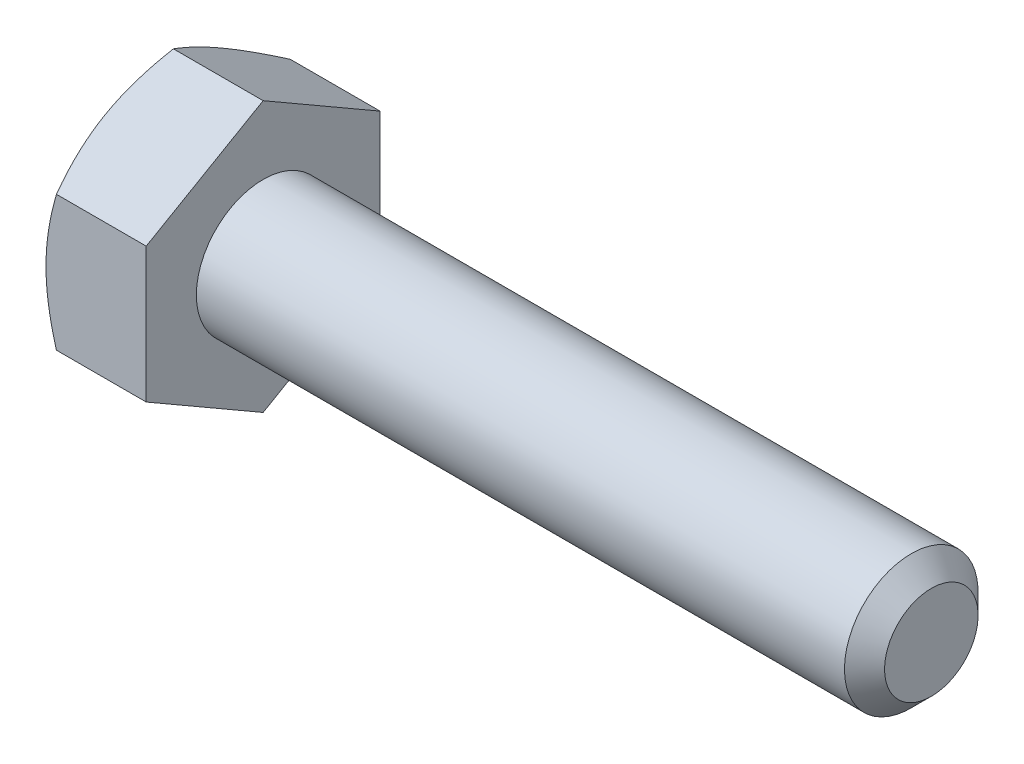
ISO-10303-21;
HEADER;
FILE_DESCRIPTION(('STEP AP214'),'2;1');
FILE_NAME('part.step','',(''),(''),'','','');
FILE_SCHEMA(('AUTOMOTIVE_DESIGN { 1 0 10303 214 1 1 1 1 }'));
ENDSEC;
DATA;
#1=APPLICATION_CONTEXT('core data for automotive mechanical design processes');
#2=APPLICATION_PROTOCOL_DEFINITION('international standard','automotive_design',2000,#1);
#3=PRODUCT_CONTEXT('',#1,'mechanical');
#4=PRODUCT('Part','Part','',(#3));
#5=PRODUCT_RELATED_PRODUCT_CATEGORY('part','',(#4));
#6=PRODUCT_DEFINITION_FORMATION('','',#4);
#7=PRODUCT_DEFINITION_CONTEXT('part definition',#1,'design');
#8=PRODUCT_DEFINITION('design','',#6,#7);
#9=PRODUCT_DEFINITION_SHAPE('','',#8);
#10=(LENGTH_UNIT() NAMED_UNIT(*) SI_UNIT(.MILLI.,.METRE.));
#11=(NAMED_UNIT(*) PLANE_ANGLE_UNIT() SI_UNIT($,.RADIAN.));
#12=(NAMED_UNIT(*) SI_UNIT($,.STERADIAN.) SOLID_ANGLE_UNIT());
#13=UNCERTAINTY_MEASURE_WITH_UNIT(LENGTH_MEASURE(1.E-05),#10,'distance_accuracy_value','');
#14=(GEOMETRIC_REPRESENTATION_CONTEXT(3) GLOBAL_UNCERTAINTY_ASSIGNED_CONTEXT((#13)) GLOBAL_UNIT_ASSIGNED_CONTEXT((#10,
#11,#12)) REPRESENTATION_CONTEXT('',''));
#15=CARTESIAN_POINT('',(0.,0.,0.));
#16=DIRECTION('',(0.,0.,1.));
#17=DIRECTION('',(1.,0.,0.));
#18=AXIS2_PLACEMENT_3D('',#15,#16,#17);
#19=CARTESIAN_POINT('',(-18.25625,-3.20790243318486,5.55625));
#20=DIRECTION('',(0.,0.,-1.));
#21=DIRECTION('',(0.,1.,0.));
#22=AXIS2_PLACEMENT_3D('',#19,#20,#21);
#23=PLANE('',#22);
#24=CARTESIAN_POINT('',(-15.4691229886887,-8.77207045449526,5.55625));
#25=CARTESIAN_POINT('',(-15.5881261326428,-8.52801829659311,5.55625));
#26=CARTESIAN_POINT('',(-15.7060321692715,-8.28342224022252,5.55625));
#27=CARTESIAN_POINT('',(-15.9390358499227,-7.79285360653077,5.55625));
#28=CARTESIAN_POINT('',(-16.0541330796759,-7.54688083265693,5.55625));
#29=CARTESIAN_POINT('',(-16.2814511006863,-7.05207592246824,5.55625));
#30=CARTESIAN_POINT('',(-16.3936541133704,-6.80323559140828,5.55625));
#31=CARTESIAN_POINT('',(-16.6136703766094,-6.30362897020877,5.55625));
#32=CARTESIAN_POINT('',(-16.7214838248073,-6.05286276738858,5.55625));
#33=CARTESIAN_POINT('',(-16.9351563460659,-5.54039731591747,5.55625));
#34=CARTESIAN_POINT('',(-17.0408227220693,-5.27861729973788,5.55625));
#35=CARTESIAN_POINT('',(-17.2445275963525,-4.75205235428892,5.55625));
#36=CARTESIAN_POINT('',(-17.3425652608825,-4.48726710018753,5.55625));
#37=CARTESIAN_POINT('',(-17.5285528061558,-3.95471852203743,5.55625));
#38=CARTESIAN_POINT('',(-17.6165218221518,-3.68696194474142,5.55625));
#39=CARTESIAN_POINT('',(-17.7796517779061,-3.1476081234435,5.55625));
#40=CARTESIAN_POINT('',(-17.8548165901121,-2.87601206764468,5.55625));
#41=CARTESIAN_POINT('',(-17.9884377069671,-2.33034664110628,5.55625));
#42=CARTESIAN_POINT('',(-18.0469883412278,-2.05630073391013,5.55625));
#43=CARTESIAN_POINT('',(-18.1441630934879,-1.50460545947177,5.55625));
#44=CARTESIAN_POINT('',(-18.1827894099004,-1.22695649325174,5.55625));
#45=CARTESIAN_POINT('',(-18.2232295735291,-0.810733335042174,5.55625));
#46=CARTESIAN_POINT('',(-18.2337791798601,-0.672975498301301,5.55625));
#47=CARTESIAN_POINT('',(-18.2490413061577,-0.397141526875541,5.55625));
#48=CARTESIAN_POINT('',(-18.2537543834335,-0.25906542384235,5.55625));
#49=CARTESIAN_POINT('',(-18.2572258055742,0.0171733095039292,5.55625));
#50=CARTESIAN_POINT('',(-18.255983637176,0.155335946248967,5.55625));
#51=CARTESIAN_POINT('',(-18.2475774256878,0.431471152756123,5.55625));
#52=CARTESIAN_POINT('',(-18.2404136182491,0.569443729862803,5.55625));
#53=CARTESIAN_POINT('',(-18.2165757903796,0.896399600671884,5.55625));
#54=CARTESIAN_POINT('',(-18.1973501330459,1.08520116985231,5.55625));
#55=CARTESIAN_POINT('',(-18.1488244662143,1.46149479186844,5.55625));
#56=CARTESIAN_POINT('',(-18.1195232178896,1.64898668078101,5.55625));
#57=CARTESIAN_POINT('',(-18.0180523365799,2.20922654926093,5.55625));
#58=CARTESIAN_POINT('',(-17.9323306001154,2.57955760972515,5.55625));
#59=CARTESIAN_POINT('',(-17.7824847122456,3.13363040167764,5.55625));
#60=CARTESIAN_POINT('',(-17.7282437663287,3.32021106601464,5.55625));
#61=CARTESIAN_POINT('',(-17.6138315900055,3.69156319498155,5.55625));
#62=CARTESIAN_POINT('',(-17.5536603131067,3.87633464541513,5.55625));
#63=CARTESIAN_POINT('',(-17.4283773152863,4.2441230262143,5.55625));
#64=CARTESIAN_POINT('',(-17.3632669456574,4.42714042115024,5.55625));
#65=CARTESIAN_POINT('',(-17.22890138029,4.79163721019221,5.55625));
#66=CARTESIAN_POINT('',(-17.1596462845855,4.97311664129675,5.55625));
#67=CARTESIAN_POINT('',(-16.9657102245216,5.4670744334381,5.55625));
#68=CARTESIAN_POINT('',(-16.8375694025087,5.77819320171945,5.55625));
#69=CARTESIAN_POINT('',(-16.5736089938556,6.39716849606375,5.55625));
#70=CARTESIAN_POINT('',(-16.4377885081078,6.70502463511876,5.55625));
#71=CARTESIAN_POINT('',(-16.1603100816322,7.31823564532238,5.55625));
#72=CARTESIAN_POINT('',(-16.0186498056387,7.62358945614287,5.55625));
#73=CARTESIAN_POINT('',(-15.7309076381346,8.23218316986509,5.55625));
#74=CARTESIAN_POINT('',(-15.5848259376875,8.53542316341681,5.55624999999999));
#75=CARTESIAN_POINT('',(-15.2889688218229,9.14071853970563,5.55624999999999));
#76=CARTESIAN_POINT('',(-15.1391876557904,9.44277110561717,5.55624999999999));
#77=CARTESIAN_POINT('',(-14.8368899451919,10.0455052971987,5.55624999999999));
#78=CARTESIAN_POINT('',(-14.6843733764165,10.3461869107056,5.55624999999999));
#79=CARTESIAN_POINT('',(-14.3771837720027,10.9463568682392,5.55624999999999));
#80=CARTESIAN_POINT('',(-14.2225112465241,11.245845473701,5.55624999999999));
#81=CARTESIAN_POINT('',(-13.9113826552738,11.8438953458859,5.55624999999999));
#82=CARTESIAN_POINT('',(-13.7549265822972,12.1424566088565,5.55624999999999));
#83=CARTESIAN_POINT('',(-13.317307687001,12.972609258055,5.55624999999999));
#84=CARTESIAN_POINT('',(-13.0345529831845,13.5033612830518,5.55624999999999));
#85=CARTESIAN_POINT('',(-12.4656737652205,14.5630967119897,5.55624999999999));
#86=CARTESIAN_POINT('',(-12.1795490330405,15.0920799986234,5.55624999999999));
#87=CARTESIAN_POINT('',(-11.6057938716424,16.1468591824136,5.55624999999999));
#88=CARTESIAN_POINT('',(-11.3181720684967,16.6726597763811,5.55624999999999));
#89=CARTESIAN_POINT('',(-10.7410185334532,17.7231558764602,5.55624999999999));
#90=CARTESIAN_POINT('',(-10.4514869604281,18.2478514698223,5.55624999999999));
#91=CARTESIAN_POINT('',(-10.1612628464255,18.7721609030213,5.55624999999999));
#92=B_SPLINE_CURVE_WITH_KNOTS('',3,(#24,#25,#26,#27,#28,#29,#30,#31,#32,#33,#34,#35,#36,#37,#38,
#39,#40,#41,#42,#43,#44,#45,#46,#47,#48,#49,#50,#51,#52,#53,#54,#55,#56,#57,#58,#59,#60,#61,#62,
#63,#64,#65,#66,#67,#68,#69,#70,#71,#72,#73,#74,#75,#76,#77,#78,#79,#80,#81,#82,#83,#84,#85,#86,
#87,#88,#89,#90,#91),.UNSPECIFIED.,.F.,.F.,(4,2,2,2,2,2,2,2,2,2,2,2,2,2,2,2,2,2,2,2,2,2,2,2,2,2,
2,2,2,2,2,2,2,4),(0.,0.814569753642696,1.62925893037343,2.44812614556049,3.2669564498196,
4.11376919586015,4.96067436132074,5.8059422948087,6.65095413352319,7.49106763482851,
8.33108841969181,8.745467189537,9.15980638878941,9.57418129922855,9.98853972043447,
10.5575554081745,11.1266410832753,12.2653551914961,12.8482170510213,13.4310834804234,
14.0137910138453,14.5964844891554,15.6057518726651,16.6151376632618,17.6249310874562,
18.6346809374172,19.6461137686029,20.6575555557855,21.6687619390222,22.6799724085906,
24.4840686723598,26.2882823049696,28.0862580232508,29.884086009441),.UNSPECIFIED.);
#93=CARTESIAN_POINT('',(-17.7599857665182,-3.20790243318486,5.55625));
#94=VERTEX_POINT('',#93);
#95=CARTESIAN_POINT('',(-18.25625,0.,5.55625));
#96=VERTEX_POINT('',#95);
#97=EDGE_CURVE('E248',#94,#96,#92,.T.);
#98=ORIENTED_EDGE('',*,*,#97,.F.);
#99=DIRECTION('',(1.,0.,0.));
#100=VECTOR('',#99,1.);
#101=CARTESIAN_POINT('',(-18.25625,-3.20790243318486,5.55625));
#102=LINE('',#101,#100);
#103=CARTESIAN_POINT('',(-13.49375,-3.20790243318486,5.55625));
#104=VERTEX_POINT('',#103);
#105=EDGE_CURVE('E251',#94,#104,#102,.T.);
#106=ORIENTED_EDGE('',*,*,#105,.T.);
#107=DIRECTION('',(0.,1.,0.));
#108=VECTOR('',#107,1.);
#109=CARTESIAN_POINT('',(-13.49375,-3.20790243318486,5.55625));
#110=LINE('',#109,#108);
#111=CARTESIAN_POINT('',(-13.49375,3.20790243318486,5.55625));
#112=VERTEX_POINT('',#111);
#113=EDGE_CURVE('E253',#104,#112,#110,.T.);
#114=ORIENTED_EDGE('',*,*,#113,.T.);
#115=DIRECTION('',(1.,0.,0.));
#116=VECTOR('',#115,1.);
#117=CARTESIAN_POINT('',(-18.25625,3.20790243318486,5.55625));
#118=LINE('',#117,#116);
#119=CARTESIAN_POINT('',(-17.7599857665182,3.20790243318486,5.55625));
#120=VERTEX_POINT('',#119);
#121=EDGE_CURVE('E221',#120,#112,#118,.T.);
#122=ORIENTED_EDGE('',*,*,#121,.F.);
#123=EDGE_CURVE('E111',#96,#120,#92,.T.);
#124=ORIENTED_EDGE('',*,*,#123,.F.);
#125=EDGE_LOOP('',(#98,#106,#114,#122,#124));
#126=FACE_BOUND('',#125,.T.);
#127=ADVANCED_FACE('F35',(#126),#23,.F.);
#128=CARTESIAN_POINT('',(-18.25625,3.20790243318486,5.55625));
#129=DIRECTION('',(0.,-0.866025403784439,-0.5));
#130=DIRECTION('',(0.,0.5,-0.866025403784439));
#131=AXIS2_PLACEMENT_3D('',#128,#129,#130);
#132=PLANE('',#131);
#133=CARTESIAN_POINT('',(-17.7599190980518,3.20778696313102,5.55645));
#134=CARTESIAN_POINT('',(-17.8006244396287,3.27830048099899,5.43431700443227));
#135=CARTESIAN_POINT('',(-17.8394824606368,3.34907690760433,5.31172863757364));
#136=CARTESIAN_POINT('',(-17.9129950665754,3.49120454378004,5.06555635055764));
#137=CARTESIAN_POINT('',(-17.9476478381981,3.56255598725623,4.94197202526351));
#138=CARTESIAN_POINT('',(-18.0446181144389,3.7777527611819,4.56924027919933));
#139=CARTESIAN_POINT('',(-18.099773945498,3.92244755263586,4.31862154881049));
#140=CARTESIAN_POINT('',(-18.164451095153,4.13898067940738,3.94357517172046));
#141=CARTESIAN_POINT('',(-18.1828758296374,4.21017202280889,3.82026814788997));
#142=CARTESIAN_POINT('',(-18.2137716337596,4.35287639627881,3.57309692257778));
#143=CARTESIAN_POINT('',(-18.226243229438,4.42438939736052,3.44923277130254));
#144=CARTESIAN_POINT('',(-18.2449149134017,4.56753961185542,3.20128932668298));
#145=CARTESIAN_POINT('',(-18.2511221193166,4.63917659144933,3.07721043832556));
#146=CARTESIAN_POINT('',(-18.2571385825862,4.7825127822332,2.82894487332451));
#147=CARTESIAN_POINT('',(-18.2569480375727,4.85421199143242,2.70475820012895));
#148=CARTESIAN_POINT('',(-18.2476317573071,5.05064720059277,2.36452243746779));
#149=CARTESIAN_POINT('',(-18.2319903403106,5.1753189069971,2.14858470770919));
#150=CARTESIAN_POINT('',(-18.1823900950254,5.42383425573453,1.71814349723526));
#151=CARTESIAN_POINT('',(-18.1484143117333,5.54767702400135,1.50364153044716));
#152=CARTESIAN_POINT('',(-18.0634842499519,5.79669255822861,1.07233397329164));
#153=CARTESIAN_POINT('',(-18.0121701119579,5.92183390122649,0.855582809091895));
#154=CARTESIAN_POINT('',(-17.8957075447076,6.17025031750736,0.425312954659244));
#155=CARTESIAN_POINT('',(-17.8305864741206,6.29352857247572,0.211788753585617));
#156=CARTESIAN_POINT('',(-17.7599190980518,6.41592033642355,-0.000200000000003627));
#157=B_SPLINE_CURVE_WITH_KNOTS('',3,(#133,#134,#135,#136,#137,#138,#139,#140,#141,#142,#143,
#144,#145,#146,#147,#148,#149,#150,#151,#152,#153,#154,#155,#156),.UNSPECIFIED.,.F.,.F.,(4,2,2,
2,2,2,2,2,2,2,2,4),(0.,0.440316908268042,0.880823012040824,1.76366572331169,2.19427472390783,
2.62484566732156,3.05492684132792,3.48499472977669,4.23370964386674,4.98311813377593,
5.74914806559356,6.51367405016872),.UNSPECIFIED.);
#158=CARTESIAN_POINT('',(-18.25625,4.81185364977729,2.778125));
#159=VERTEX_POINT('',#158);
#160=EDGE_CURVE('E107',#120,#159,#157,.T.);
#161=ORIENTED_EDGE('',*,*,#160,.F.);
#162=ORIENTED_EDGE('',*,*,#121,.T.);
#163=DIRECTION('',(0.,0.5,-0.866025403784439));
#164=VECTOR('',#163,1.);
#165=CARTESIAN_POINT('',(-13.49375,3.20790243318486,5.55625));
#166=LINE('',#165,#164);
#167=CARTESIAN_POINT('',(-13.49375,6.41580486636972,0.));
#168=VERTEX_POINT('',#167);
#169=EDGE_CURVE('E271',#112,#168,#166,.T.);
#170=ORIENTED_EDGE('',*,*,#169,.T.);
#171=DIRECTION('',(1.,0.,0.));
#172=VECTOR('',#171,1.);
#173=CARTESIAN_POINT('',(-18.25625,6.41580486636972,0.));
#174=LINE('',#173,#172);
#175=CARTESIAN_POINT('',(-17.7599857665182,6.41580486636972,0.));
#176=VERTEX_POINT('',#175);
#177=EDGE_CURVE('E130',#176,#168,#174,.T.);
#178=ORIENTED_EDGE('',*,*,#177,.F.);
#179=EDGE_CURVE('E115',#159,#176,#157,.T.);
#180=ORIENTED_EDGE('',*,*,#179,.F.);
#181=EDGE_LOOP('',(#161,#162,#170,#178,#180));
#182=FACE_BOUND('',#181,.T.);
#183=ADVANCED_FACE('F128',(#182),#132,.F.);
#184=CARTESIAN_POINT('',(-18.25625,6.41580486636972,0.));
#185=DIRECTION('',(0.,-0.866025403784439,0.5));
#186=DIRECTION('',(0.,-0.5,-0.866025403784439));
#187=AXIS2_PLACEMENT_3D('',#184,#185,#186);
#188=PLANE('',#187);
#189=CARTESIAN_POINT('',(-17.7599190980518,6.41592033642355,0.000199999999995761));
#190=CARTESIAN_POINT('',(-17.8006244396287,6.34540681855559,-0.121932995567734));
#191=CARTESIAN_POINT('',(-17.8394824606368,6.27463039195025,-0.244521362426356));
#192=CARTESIAN_POINT('',(-17.9129950665754,6.13250275577453,-0.490693649442359));
#193=CARTESIAN_POINT('',(-17.9476478381981,6.06115131229835,-0.61427797473649));
#194=CARTESIAN_POINT('',(-18.0446181144389,5.84595453837268,-0.987009720800665));
#195=CARTESIAN_POINT('',(-18.099773945498,5.70125974691872,-1.23762845118951));
#196=CARTESIAN_POINT('',(-18.164451095153,5.48472662014719,-1.61267482827954));
#197=CARTESIAN_POINT('',(-18.1828758296374,5.41353527674569,-1.73598185211003));
#198=CARTESIAN_POINT('',(-18.2137716337596,5.27083090327577,-1.98315307742222));
#199=CARTESIAN_POINT('',(-18.226243229438,5.19931790219406,-2.10701722869746));
#200=CARTESIAN_POINT('',(-18.2449149134017,5.05616768769916,-2.35496067331702));
#201=CARTESIAN_POINT('',(-18.2511221193166,4.98453070810525,-2.47903956167444));
#202=CARTESIAN_POINT('',(-18.2571385825862,4.84119451732138,-2.72730512667549));
#203=CARTESIAN_POINT('',(-18.2569480375727,4.76949530812215,-2.85149179987105));
#204=CARTESIAN_POINT('',(-18.2476317573071,4.5730600989618,-3.19172756253221));
#205=CARTESIAN_POINT('',(-18.2319903403106,4.44838839255747,-3.40766529229081));
#206=CARTESIAN_POINT('',(-18.1823900950254,4.19987304382004,-3.83810650276474));
#207=CARTESIAN_POINT('',(-18.1484143117333,4.07603027555323,-4.05260846955284));
#208=CARTESIAN_POINT('',(-18.0634842499519,3.82701474132597,-4.48391602670836));
#209=CARTESIAN_POINT('',(-18.0121701119579,3.70187339832809,-4.7006671909081));
#210=CARTESIAN_POINT('',(-17.8957075447076,3.45345698204721,-5.13093704534075));
#211=CARTESIAN_POINT('',(-17.8305864741206,3.33017872707886,-5.34446124641438));
#212=CARTESIAN_POINT('',(-17.7599190980518,3.20778696313102,-5.55645));
#213=B_SPLINE_CURVE_WITH_KNOTS('',3,(#189,#190,#191,#192,#193,#194,#195,#196,#197,#198,#199,
#200,#201,#202,#203,#204,#205,#206,#207,#208,#209,#210,#211,#212),.UNSPECIFIED.,.F.,.F.,(4,2,2,
2,2,2,2,2,2,2,2,4),(0.,0.44031690826804,0.880823012040821,1.76366572331169,2.19427472390783,
2.62484566732156,3.05492684132792,3.48499472977669,4.23370964386674,4.98311813377592,
5.74914806559356,6.51367405016872),.UNSPECIFIED.);
#214=CARTESIAN_POINT('',(-18.25625,4.81185364977729,-2.778125));
#215=VERTEX_POINT('',#214);
#216=EDGE_CURVE('E120',#176,#215,#213,.T.);
#217=ORIENTED_EDGE('',*,*,#216,.F.);
#218=ORIENTED_EDGE('',*,*,#177,.T.);
#219=DIRECTION('',(0.,-0.5,-0.866025403784439));
#220=VECTOR('',#219,1.);
#221=CARTESIAN_POINT('',(-13.49375,6.41580486636972,0.));
#222=LINE('',#221,#220);
#223=CARTESIAN_POINT('',(-13.49375,3.20790243318486,-5.55625));
#224=VERTEX_POINT('',#223);
#225=EDGE_CURVE('E268',#168,#224,#222,.T.);
#226=ORIENTED_EDGE('',*,*,#225,.T.);
#227=DIRECTION('',(1.,0.,0.));
#228=VECTOR('',#227,1.);
#229=CARTESIAN_POINT('',(-18.25625,3.20790243318486,-5.55625));
#230=LINE('',#229,#228);
#231=CARTESIAN_POINT('',(-17.7599857665182,3.20790243318486,-5.55625));
#232=VERTEX_POINT('',#231);
#233=EDGE_CURVE('E265',#232,#224,#230,.T.);
#234=ORIENTED_EDGE('',*,*,#233,.F.);
#235=EDGE_CURVE('E131',#215,#232,#213,.T.);
#236=ORIENTED_EDGE('',*,*,#235,.F.);
#237=EDGE_LOOP('',(#217,#218,#226,#234,#236));
#238=FACE_BOUND('',#237,.T.);
#239=ADVANCED_FACE('F185',(#238),#188,.F.);
#240=CARTESIAN_POINT('',(-18.25625,3.20790243318486,-5.55625));
#241=DIRECTION('',(0.,0.,1.));
#242=DIRECTION('',(1.,0.,0.));
#243=AXIS2_PLACEMENT_3D('',#240,#241,#242);
#244=PLANE('',#243);
#245=CARTESIAN_POINT('',(-15.4691229925352,-8.7720704466088,-5.55625));
#246=CARTESIAN_POINT('',(-15.5881261363293,-8.52801828897227,-5.55625));
#247=CARTESIAN_POINT('',(-15.7060321727979,-8.28342223286749,-5.55625));
#248=CARTESIAN_POINT('',(-15.9390358531297,-7.79285359970816,-5.55625));
#249=CARTESIAN_POINT('',(-16.0541330827236,-7.54688082610092,-5.55625));
#250=CARTESIAN_POINT('',(-16.2814511034154,-7.05207591644942,-5.55625));
#251=CARTESIAN_POINT('',(-16.3936541159403,-6.80323558566005,-5.55625));
#252=CARTESIAN_POINT('',(-16.6136703788632,-6.30362896500353,-5.55625));
#253=CARTESIAN_POINT('',(-16.7214838269044,-6.05286276245574,-5.55625));
#254=CARTESIAN_POINT('',(-16.9351563478446,-5.54039731155133,-5.55625));
#255=CARTESIAN_POINT('',(-17.0408227236867,-5.27861729566625,-5.55625));
#256=CARTESIAN_POINT('',(-17.2445275976557,-4.75205235081095,-5.55625));
#257=CARTESIAN_POINT('',(-17.3425652620329,-4.48726709700873,-5.55625));
#258=CARTESIAN_POINT('',(-17.5285528070149,-3.95471851946249,-5.55625));
#259=CARTESIAN_POINT('',(-17.6165218228724,-3.68696194247114,-5.55625));
#260=CARTESIAN_POINT('',(-17.779651778372,-3.14760812179079,-5.55625));
#261=CARTESIAN_POINT('',(-17.8548165904617,-2.87601206630488,-5.55625));
#262=CARTESIAN_POINT('',(-17.9884377070818,-2.33034664055046,-5.55625));
#263=CARTESIAN_POINT('',(-18.0469883412324,-2.05630073382754,-5.55625));
#264=CARTESIAN_POINT('',(-18.1441630933435,-1.50460546034754,-5.55625));
#265=CARTESIAN_POINT('',(-18.1827894097171,-1.22695649461262,-5.55625));
#266=CARTESIAN_POINT('',(-18.2232295733518,-0.810733337127513,-5.55625));
#267=CARTESIAN_POINT('',(-18.2337791796954,-0.67297550062459,-5.55625));
#268=CARTESIAN_POINT('',(-18.249041306039,-0.397141529674346,-5.55625));
#269=CARTESIAN_POINT('',(-18.2537543833484,-0.259065426878718,-5.55625));
#270=CARTESIAN_POINT('',(-18.2572258055771,0.017173305994083,-5.55625));
#271=CARTESIAN_POINT('',(-18.2559836372332,0.155335942503207,-5.55625));
#272=CARTESIAN_POINT('',(-18.247577425873,0.431471148541614,-5.55625));
#273=CARTESIAN_POINT('',(-18.240413618508,0.569443725415459,-5.55625));
#274=CARTESIAN_POINT('',(-18.2165757908194,0.896399595868995,-5.55625));
#275=CARTESIAN_POINT('',(-18.1973501335897,1.0852011649277,-5.55625));
#276=CARTESIAN_POINT('',(-18.1488244669714,1.46149478670604,-5.55625));
#277=CARTESIAN_POINT('',(-18.1195232187562,1.64898667550252,-5.55625));
#278=CARTESIAN_POINT('',(-18.0180523377769,2.20922654364067,-5.55625));
#279=CARTESIAN_POINT('',(-17.9323306015355,2.57955760388627,-5.55625));
#280=CARTESIAN_POINT('',(-17.7824847139946,3.1336303955118,-5.55625));
#281=CARTESIAN_POINT('',(-17.7282437681881,3.3202110597374,-5.55625));
#282=CARTESIAN_POINT('',(-17.6138315920822,3.69156318848282,-5.55625));
#283=CARTESIAN_POINT('',(-17.5536603152903,3.87633463880631,-5.55625));
#284=CARTESIAN_POINT('',(-17.4283773176798,4.24412301938616,-5.55625));
#285=CARTESIAN_POINT('',(-17.3632669481538,4.42714041421287,-5.55625));
#286=CARTESIAN_POINT('',(-17.2289013829887,4.79163720303637,-5.55625));
#287=CARTESIAN_POINT('',(-17.1596462873835,4.97311663403166,-5.55625));
#288=CARTESIAN_POINT('',(-16.9657102274923,5.46707442611312,-5.55625));
#289=CARTESIAN_POINT('',(-16.8375694055415,5.77819319444042,-5.55625));
#290=CARTESIAN_POINT('',(-16.5736089969943,6.39716848887065,-5.55625));
#291=CARTESIAN_POINT('',(-16.4377885112902,6.70502462796562,-5.55625));
#292=CARTESIAN_POINT('',(-16.160310084889,7.31823563824489,-5.55625));
#293=CARTESIAN_POINT('',(-16.0186498089262,7.62358944910107,-5.55625));
#294=CARTESIAN_POINT('',(-15.7309076414739,8.23218316289078,-5.55625));
#295=CARTESIAN_POINT('',(-15.5848259410482,8.5354231564743,-5.55625));
#296=CARTESIAN_POINT('',(-15.2889688252184,9.14071853282587,-5.55625));
#297=CARTESIAN_POINT('',(-15.1391876591994,9.44277109876833,-5.55625));
#298=CARTESIAN_POINT('',(-14.8368899486229,10.0455052904094,-5.55625));
#299=CARTESIAN_POINT('',(-14.684373379856,10.346186903945,-5.55625));
#300=CARTESIAN_POINT('',(-14.3771837754556,10.9463568615337,-5.55625));
#301=CARTESIAN_POINT('',(-14.2225112499819,11.2458454670221,-5.55625));
#302=CARTESIAN_POINT('',(-13.9113826587384,11.8438953392585,-5.55625));
#303=CARTESIAN_POINT('',(-13.7549265857638,12.1424566022543,-5.55625));
#304=CARTESIAN_POINT('',(-13.3173076904924,12.9726092514787,-5.55625));
#305=CARTESIAN_POINT('',(-13.0345529866967,13.5033612764754,-5.55625));
#306=CARTESIAN_POINT('',(-12.4656737687701,14.563096705411,-5.55625));
#307=CARTESIAN_POINT('',(-12.1795490366065,15.0920799920427,-5.55625));
#308=CARTESIAN_POINT('',(-11.6057938752427,16.1468591758199,-5.55625));
#309=CARTESIAN_POINT('',(-11.3181720721146,16.6726597697766,-5.55625));
#310=CARTESIAN_POINT('',(-10.7410185371047,17.7231558698327,-5.55625));
#311=CARTESIAN_POINT('',(-10.4514869640955,18.2478514631828,-5.55625));
#312=CARTESIAN_POINT('',(-10.1612628501081,18.7721608963694,-5.55625));
#313=B_SPLINE_CURVE_WITH_KNOTS('',3,(#245,#246,#247,#248,#249,#250,#251,#252,#253,#254,#255,
#256,#257,#258,#259,#260,#261,#262,#263,#264,#265,#266,#267,#268,#269,#270,#271,#272,#273,#274,
#275,#276,#277,#278,#279,#280,#281,#282,#283,#284,#285,#286,#287,#288,#289,#290,#291,#292,#293,
#294,#295,#296,#297,#298,#299,#300,#301,#302,#303,#304,#305,#306,#307,#308,#309,#310,#311,#312),
.UNSPECIFIED.,.F.,.F.,(4,2,2,2,2,2,2,2,2,2,2,2,2,2,2,2,2,2,2,2,2,2,2,2,2,2,2,2,2,2,2,2,2,4),(0.,
0.814569752715872,1.62925892851965,2.44812614277022,3.26695644609292,4.11376919113312,
4.96067435559305,5.80594228808351,6.65095412580128,7.49106762565219,8.33108840906319,
8.74546717820007,9.15980637674434,9.57418128647495,9.98853970697242,10.5575553943178,
11.1266410690239,12.2653551764536,12.8482170355653,13.4310834645539,14.0137909975635,
14.5964844724611,15.6057518560265,16.6151376466796,17.6249310709323,18.6346809209514,
19.6461137522022,20.6575555394498,21.6687619227504,22.6799723923827,24.4840686561223,
26.2882822887029,28.0862580069301,29.8840859930656),.UNSPECIFIED.);
#314=CARTESIAN_POINT('',(-18.25625,0.,-5.55625));
#315=VERTEX_POINT('',#314);
#316=EDGE_CURVE('E179',#232,#315,#313,.F.);
#317=ORIENTED_EDGE('',*,*,#316,.F.);
#318=ORIENTED_EDGE('',*,*,#233,.T.);
#319=DIRECTION('',(0.,-1.,0.));
#320=VECTOR('',#319,1.);
#321=CARTESIAN_POINT('',(-13.49375,3.20790243318486,-5.55625));
#322=LINE('',#321,#320);
#323=CARTESIAN_POINT('',(-13.49375,-3.20790243318486,-5.55625));
#324=VERTEX_POINT('',#323);
#325=EDGE_CURVE('E275',#224,#324,#322,.T.);
#326=ORIENTED_EDGE('',*,*,#325,.T.);
#327=DIRECTION('',(1.,0.,0.));
#328=VECTOR('',#327,1.);
#329=CARTESIAN_POINT('',(-18.25625,-3.20790243318486,-5.55625));
#330=LINE('',#329,#328);
#331=CARTESIAN_POINT('',(-17.7599857665182,-3.20790243318486,-5.55625));
#332=VERTEX_POINT('',#331);
#333=EDGE_CURVE('E236',#332,#324,#330,.T.);
#334=ORIENTED_EDGE('',*,*,#333,.F.);
#335=EDGE_CURVE('E174',#315,#332,#313,.F.);
#336=ORIENTED_EDGE('',*,*,#335,.F.);
#337=EDGE_LOOP('',(#317,#318,#326,#334,#336));
#338=FACE_BOUND('',#337,.T.);
#339=ADVANCED_FACE('F181',(#338),#244,.F.);
#340=CARTESIAN_POINT('',(-18.25625,-3.20790243318486,-5.55625));
#341=DIRECTION('',(0.,0.866025403784439,0.5));
#342=DIRECTION('',(0.,-0.5,0.866025403784439));
#343=AXIS2_PLACEMENT_3D('',#340,#341,#342);
#344=PLANE('',#343);
#345=CARTESIAN_POINT('',(-17.7599190980518,-3.20778696313102,-5.55645));
#346=CARTESIAN_POINT('',(-17.8006244396287,-3.27830048099899,-5.43431700443227));
#347=CARTESIAN_POINT('',(-17.8394824606368,-3.34907690760433,-5.31172863757365));
#348=CARTESIAN_POINT('',(-17.9129950665754,-3.49120454378004,-5.06555635055764));
#349=CARTESIAN_POINT('',(-17.9476478381981,-3.56255598725623,-4.94197202526351));
#350=CARTESIAN_POINT('',(-18.0446181144389,-3.7777527611819,-4.56924027919934));
#351=CARTESIAN_POINT('',(-18.099773945498,-3.92244755263586,-4.3186215488105));
#352=CARTESIAN_POINT('',(-18.164451095153,-4.13898067940739,-3.94357517172046));
#353=CARTESIAN_POINT('',(-18.1828758296374,-4.21017202280889,-3.82026814788998));
#354=CARTESIAN_POINT('',(-18.2137716337596,-4.35287639627881,-3.57309692257778));
#355=CARTESIAN_POINT('',(-18.226243229438,-4.42438939736052,-3.44923277130254));
#356=CARTESIAN_POINT('',(-18.2449149134017,-4.56753961185542,-3.20128932668298));
#357=CARTESIAN_POINT('',(-18.2511221193166,-4.63917659144933,-3.07721043832556));
#358=CARTESIAN_POINT('',(-18.2571385825862,-4.7825127822332,-2.82894487332451));
#359=CARTESIAN_POINT('',(-18.2569480375727,-4.85421199143242,-2.70475820012895));
#360=CARTESIAN_POINT('',(-18.2476317573071,-5.05064720059278,-2.36452243746779));
#361=CARTESIAN_POINT('',(-18.2319903403106,-5.1753189069971,-2.14858470770919));
#362=CARTESIAN_POINT('',(-18.1823900950254,-5.42383425573454,-1.71814349723526));
#363=CARTESIAN_POINT('',(-18.1484143117333,-5.54767702400135,-1.50364153044716));
#364=CARTESIAN_POINT('',(-18.0634842499519,-5.79669255822861,-1.07233397329164));
#365=CARTESIAN_POINT('',(-18.0121701119579,-5.92183390122649,-0.855582809091898));
#366=CARTESIAN_POINT('',(-17.8957075447076,-6.17025031750736,-0.425312954659248));
#367=CARTESIAN_POINT('',(-17.8305864741206,-6.29352857247572,-0.211788753585623));
#368=CARTESIAN_POINT('',(-17.7599190980518,-6.41592033642355,0.000199999999998163));
#369=B_SPLINE_CURVE_WITH_KNOTS('',3,(#345,#346,#347,#348,#349,#350,#351,#352,#353,#354,#355,
#356,#357,#358,#359,#360,#361,#362,#363,#364,#365,#366,#367,#368),.UNSPECIFIED.,.F.,.F.,(4,2,2,
2,2,2,2,2,2,2,2,4),(0.,0.440316908268041,0.880823012040822,1.76366572331169,2.19427472390783,
2.62484566732156,3.05492684132792,3.4849947297767,4.23370964386675,4.98311813377593,
5.74914806559356,6.51367405016872),.UNSPECIFIED.);
#370=CARTESIAN_POINT('',(-18.25625,-4.81185364977729,-2.778125));
#371=VERTEX_POINT('',#370);
#372=EDGE_CURVE('E180',#332,#371,#369,.T.);
#373=ORIENTED_EDGE('',*,*,#372,.F.);
#374=ORIENTED_EDGE('',*,*,#333,.T.);
#375=DIRECTION('',(0.,-0.5,0.866025403784439));
#376=VECTOR('',#375,1.);
#377=CARTESIAN_POINT('',(-13.49375,-3.20790243318486,-5.55625));
#378=LINE('',#377,#376);
#379=CARTESIAN_POINT('',(-13.49375,-6.41580486636972,0.));
#380=VERTEX_POINT('',#379);
#381=EDGE_CURVE('E260',#324,#380,#378,.T.);
#382=ORIENTED_EDGE('',*,*,#381,.T.);
#383=DIRECTION('',(1.,0.,0.));
#384=VECTOR('',#383,1.);
#385=CARTESIAN_POINT('',(-18.25625,-6.41580486636972,0.));
#386=LINE('',#385,#384);
#387=CARTESIAN_POINT('',(-17.7599857665182,-6.41580486636972,0.));
#388=VERTEX_POINT('',#387);
#389=EDGE_CURVE('E257',#388,#380,#386,.T.);
#390=ORIENTED_EDGE('',*,*,#389,.F.);
#391=EDGE_CURVE('E169',#371,#388,#369,.T.);
#392=ORIENTED_EDGE('',*,*,#391,.F.);
#393=EDGE_LOOP('',(#373,#374,#382,#390,#392));
#394=FACE_BOUND('',#393,.T.);
#395=ADVANCED_FACE('F184',(#394),#344,.F.);
#396=CARTESIAN_POINT('',(-18.25625,-6.41580486636972,0.));
#397=DIRECTION('',(0.,0.866025403784439,-0.5));
#398=DIRECTION('',(0.,0.5,0.866025403784439));
#399=AXIS2_PLACEMENT_3D('',#396,#397,#398);
#400=PLANE('',#399);
#401=CARTESIAN_POINT('',(-17.7599190980518,-6.41592033642355,-0.00020000000000181));
#402=CARTESIAN_POINT('',(-17.8006244396287,-6.34540681855559,0.121932995567729));
#403=CARTESIAN_POINT('',(-17.8394824606368,-6.27463039195025,0.244521362426351));
#404=CARTESIAN_POINT('',(-17.9129950665754,-6.13250275577453,0.490693649442354));
#405=CARTESIAN_POINT('',(-17.9476478381981,-6.06115131229835,0.614277974736485));
#406=CARTESIAN_POINT('',(-18.0446181144389,-5.84595453837268,0.987009720800661));
#407=CARTESIAN_POINT('',(-18.099773945498,-5.70125974691872,1.2376284511895));
#408=CARTESIAN_POINT('',(-18.164451095153,-5.48472662014719,1.61267482827954));
#409=CARTESIAN_POINT('',(-18.1828758296374,-5.41353527674569,1.73598185211002));
#410=CARTESIAN_POINT('',(-18.2137716337596,-5.27083090327577,1.98315307742221));
#411=CARTESIAN_POINT('',(-18.226243229438,-5.19931790219406,2.10701722869746));
#412=CARTESIAN_POINT('',(-18.2449149134017,-5.05616768769916,2.35496067331701));
#413=CARTESIAN_POINT('',(-18.2511221193166,-4.98453070810525,2.47903956167444));
#414=CARTESIAN_POINT('',(-18.2571385825862,-4.84119451732138,2.72730512667549));
#415=CARTESIAN_POINT('',(-18.2569480375727,-4.76949530812216,2.85149179987105));
#416=CARTESIAN_POINT('',(-18.2476317573071,-4.5730600989618,3.1917275625322));
#417=CARTESIAN_POINT('',(-18.2319903403106,-4.44838839255747,3.40766529229081));
#418=CARTESIAN_POINT('',(-18.1823900950254,-4.19987304382004,3.83810650276474));
#419=CARTESIAN_POINT('',(-18.1484143117333,-4.07603027555323,4.05260846955284));
#420=CARTESIAN_POINT('',(-18.0634842499519,-3.82701474132597,4.48391602670836));
#421=CARTESIAN_POINT('',(-18.0121701119579,-3.70187339832808,4.7006671909081));
#422=CARTESIAN_POINT('',(-17.8957075447076,-3.45345698204721,5.13093704534075));
#423=CARTESIAN_POINT('',(-17.8305864741206,-3.33017872707885,5.34446124641438));
#424=CARTESIAN_POINT('',(-17.7599190980518,-3.20778696313102,5.55645));
#425=B_SPLINE_CURVE_WITH_KNOTS('',3,(#401,#402,#403,#404,#405,#406,#407,#408,#409,#410,#411,
#412,#413,#414,#415,#416,#417,#418,#419,#420,#421,#422,#423,#424),.UNSPECIFIED.,.F.,.F.,(4,2,2,
2,2,2,2,2,2,2,2,4),(0.,0.440316908268041,0.880823012040822,1.76366572331169,2.19427472390783,
2.62484566732156,3.05492684132792,3.48499472977669,4.23370964386675,4.98311813377593,
5.74914806559356,6.51367405016872),.UNSPECIFIED.);
#426=CARTESIAN_POINT('',(-18.25625,-4.81185364977729,2.778125));
#427=VERTEX_POINT('',#426);
#428=EDGE_CURVE('E243',#388,#427,#425,.T.);
#429=ORIENTED_EDGE('',*,*,#428,.F.);
#430=ORIENTED_EDGE('',*,*,#389,.T.);
#431=DIRECTION('',(0.,0.5,0.866025403784439));
#432=VECTOR('',#431,1.);
#433=CARTESIAN_POINT('',(-13.49375,-6.41580486636972,0.));
#434=LINE('',#433,#432);
#435=EDGE_CURVE('E255',#380,#104,#434,.T.);
#436=ORIENTED_EDGE('',*,*,#435,.T.);
#437=ORIENTED_EDGE('',*,*,#105,.F.);
#438=EDGE_CURVE('E125',#427,#94,#425,.T.);
#439=ORIENTED_EDGE('',*,*,#438,.F.);
#440=EDGE_LOOP('',(#429,#430,#436,#437,#439));
#441=FACE_BOUND('',#440,.T.);
#442=ADVANCED_FACE('F206',(#441),#400,.F.);
#443=CARTESIAN_POINT('',(-13.49375,0.,0.));
#444=DIRECTION('',(1.,0.,0.));
#445=DIRECTION('',(0.,0.,-1.));
#446=AXIS2_PLACEMENT_3D('',#443,#444,#445);
#447=CYLINDRICAL_SURFACE('',#446,3.175);
#448=CARTESIAN_POINT('',(17.30375,0.,0.));
#449=DIRECTION('',(1.,0.,0.));
#450=DIRECTION('',(0.,0.,-1.));
#451=AXIS2_PLACEMENT_3D('',#448,#449,#450);
#452=CIRCLE('',#451,3.175);
#453=CARTESIAN_POINT('',(17.30375,0.,3.175));
#454=VERTEX_POINT('',#453);
#455=EDGE_CURVE('E215',#454,#454,#452,.F.);
#456=ORIENTED_EDGE('',*,*,#455,.T.);
#457=EDGE_LOOP('',(#456));
#458=FACE_BOUND('',#457,.T.);
#459=CARTESIAN_POINT('',(-13.49375,0.,0.));
#460=DIRECTION('',(-1.,0.,0.));
#461=DIRECTION('',(0.,0.,1.));
#462=AXIS2_PLACEMENT_3D('',#459,#460,#461);
#463=CIRCLE('',#462,3.175);
#464=CARTESIAN_POINT('',(-13.49375,0.,3.175));
#465=VERTEX_POINT('',#464);
#466=EDGE_CURVE('E218',#465,#465,#463,.F.);
#467=ORIENTED_EDGE('',*,*,#466,.T.);
#468=EDGE_LOOP('',(#467));
#469=FACE_BOUND('',#468,.T.);
#470=ADVANCED_FACE('F203',(#458,#469),#447,.T.);
#471=CARTESIAN_POINT('',(18.25625,0.,0.));
#472=DIRECTION('',(1.,0.,0.));
#473=DIRECTION('',(0.,0.,-1.));
#474=AXIS2_PLACEMENT_3D('',#471,#472,#473);
#475=PLANE('',#474);
#476=CARTESIAN_POINT('',(18.25625,0.,0.));
#477=DIRECTION('',(1.,0.,0.));
#478=DIRECTION('',(0.,0.,-1.));
#479=AXIS2_PLACEMENT_3D('',#476,#477,#478);
#480=CIRCLE('',#479,2.2225);
#481=CARTESIAN_POINT('',(18.25625,0.,2.2225));
#482=VERTEX_POINT('',#481);
#483=EDGE_CURVE('E220',#482,#482,#480,.T.);
#484=ORIENTED_EDGE('',*,*,#483,.T.);
#485=EDGE_LOOP('',(#484));
#486=FACE_BOUND('',#485,.T.);
#487=ADVANCED_FACE('F201',(#486),#475,.T.);
#488=CARTESIAN_POINT('',(18.25625,0.,0.));
#489=DIRECTION('',(-1.,0.,0.));
#490=DIRECTION('',(0.,0.,1.));
#491=AXIS2_PLACEMENT_3D('',#488,#489,#490);
#492=CONICAL_SURFACE('',#491,2.2225,0.785398163397446);
#493=CARTESIAN_POINT('',(17.30375,0.,3.175));
#494=CARTESIAN_POINT('',(17.313671875,0.,3.165078125));
#495=CARTESIAN_POINT('',(17.32359375,0.,3.15515625));
#496=CARTESIAN_POINT('',(17.3434375,0.,3.1353125));
#497=CARTESIAN_POINT('',(17.353359375,0.,3.125390625));
#498=CARTESIAN_POINT('',(17.373203125,0.,3.105546875));
#499=CARTESIAN_POINT('',(17.383125,0.,3.095625));
#500=CARTESIAN_POINT('',(17.40296875,0.,3.07578125));
#501=CARTESIAN_POINT('',(17.412890625,0.,3.065859375));
#502=CARTESIAN_POINT('',(17.432734375,0.,3.046015625));
#503=CARTESIAN_POINT('',(17.44265625,0.,3.03609375));
#504=CARTESIAN_POINT('',(17.4625,0.,3.01625));
#505=CARTESIAN_POINT('',(17.472421875,0.,3.006328125));
#506=CARTESIAN_POINT('',(17.492265625,0.,2.986484375));
#507=CARTESIAN_POINT('',(17.5021875,0.,2.9765625));
#508=CARTESIAN_POINT('',(17.52203125,0.,2.95671875));
#509=CARTESIAN_POINT('',(17.531953125,0.,2.946796875));
#510=CARTESIAN_POINT('',(17.551796875,0.,2.926953125));
#511=CARTESIAN_POINT('',(17.56171875,0.,2.91703125));
#512=CARTESIAN_POINT('',(17.5815625,0.,2.8971875));
#513=CARTESIAN_POINT('',(17.591484375,0.,2.887265625));
#514=CARTESIAN_POINT('',(17.611328125,0.,2.867421875));
#515=CARTESIAN_POINT('',(17.62125,0.,2.8575));
#516=CARTESIAN_POINT('',(17.64109375,0.,2.83765625));
#517=CARTESIAN_POINT('',(17.651015625,0.,2.827734375));
#518=CARTESIAN_POINT('',(17.670859375,0.,2.807890625));
#519=CARTESIAN_POINT('',(17.68078125,0.,2.79796875));
#520=CARTESIAN_POINT('',(17.700625,0.,2.778125));
#521=CARTESIAN_POINT('',(17.710546875,0.,2.768203125));
#522=CARTESIAN_POINT('',(17.730390625,0.,2.748359375));
#523=CARTESIAN_POINT('',(17.7403125,0.,2.7384375));
#524=CARTESIAN_POINT('',(17.76015625,0.,2.71859375));
#525=CARTESIAN_POINT('',(17.770078125,0.,2.708671875));
#526=CARTESIAN_POINT('',(17.789921875,0.,2.688828125));
#527=CARTESIAN_POINT('',(17.79984375,0.,2.67890625));
#528=CARTESIAN_POINT('',(17.8196875,0.,2.6590625));
#529=CARTESIAN_POINT('',(17.829609375,0.,2.649140625));
#530=CARTESIAN_POINT('',(17.849453125,0.,2.629296875));
#531=CARTESIAN_POINT('',(17.859375,0.,2.619375));
#532=CARTESIAN_POINT('',(17.87921875,0.,2.59953125));
#533=CARTESIAN_POINT('',(17.889140625,0.,2.589609375));
#534=CARTESIAN_POINT('',(17.908984375,0.,2.569765625));
#535=CARTESIAN_POINT('',(17.91890625,0.,2.55984375));
#536=CARTESIAN_POINT('',(17.93875,0.,2.54));
#537=CARTESIAN_POINT('',(17.948671875,0.,2.530078125));
#538=CARTESIAN_POINT('',(17.968515625,0.,2.510234375));
#539=CARTESIAN_POINT('',(17.9784375,0.,2.5003125));
#540=CARTESIAN_POINT('',(17.99828125,0.,2.48046875));
#541=CARTESIAN_POINT('',(18.008203125,0.,2.470546875));
#542=CARTESIAN_POINT('',(18.028046875,0.,2.450703125));
#543=CARTESIAN_POINT('',(18.03796875,0.,2.44078125));
#544=CARTESIAN_POINT('',(18.0578125,0.,2.4209375));
#545=CARTESIAN_POINT('',(18.067734375,0.,2.411015625));
#546=CARTESIAN_POINT('',(18.087578125,0.,2.391171875));
#547=CARTESIAN_POINT('',(18.0975,0.,2.38125));
#548=CARTESIAN_POINT('',(18.11734375,0.,2.36140625));
#549=CARTESIAN_POINT('',(18.127265625,0.,2.351484375));
#550=CARTESIAN_POINT('',(18.147109375,0.,2.331640625));
#551=CARTESIAN_POINT('',(18.15703125,0.,2.32171875));
#552=CARTESIAN_POINT('',(18.176875,0.,2.301875));
#553=CARTESIAN_POINT('',(18.186796875,0.,2.291953125));
#554=CARTESIAN_POINT('',(18.206640625,0.,2.272109375));
#555=CARTESIAN_POINT('',(18.2165625,0.,2.2621875));
#556=CARTESIAN_POINT('',(18.23640625,0.,2.24234375));
#557=CARTESIAN_POINT('',(18.246328125,0.,2.232421875));
#558=CARTESIAN_POINT('',(18.25625,0.,2.2225));
#559=B_SPLINE_CURVE_WITH_KNOTS('',3,(#493,#494,#495,#496,#497,#498,#499,#500,#501,#502,#503,
#504,#505,#506,#507,#508,#509,#510,#511,#512,#513,#514,#515,#516,#517,#518,#519,#520,#521,#522,
#523,#524,#525,#526,#527,#528,#529,#530,#531,#532,#533,#534,#535,#536,#537,#538,#539,#540,#541,
#542,#543,#544,#545,#546,#547,#548,#549,#550,#551,#552,#553,#554,#555,#556,#557,#558),
.UNSPECIFIED.,.F.,.F.,(4,2,2,2,2,2,2,2,2,2,2,2,2,2,2,2,2,2,2,2,2,2,2,2,2,2,2,2,2,2,2,2,4),(0.,
0.042094950567512,0.0841899011350241,0.126284851702536,0.168379802270048,0.21047475283756,
0.25256970340507,0.294664653972582,0.336759604540094,0.378854555107606,0.420949505675118,
0.463044456242628,0.50513940681014,0.547234357377652,0.589329307945164,0.631424258512676,
0.673519209080186,0.715614159647698,0.75770911021521,0.799804060782723,0.841899011350235,
0.883993961917747,0.926088912485257,0.968183863052769,1.01027881362028,1.05237376418779,
1.09446871475531,1.13656366532281,1.17865861589033,1.22075356645784,1.26284851702535,
1.30494346759286,1.34703841816038),.UNSPECIFIED.);
#560=EDGE_CURVE('BSEAM37',#454,#482,#559,.T.);
#561=ORIENTED_EDGE('',*,*,#455,.F.);
#562=ORIENTED_EDGE('',*,*,#483,.F.);
#563=ORIENTED_EDGE('',*,*,#560,.T.);
#564=ORIENTED_EDGE('',*,*,#560,.F.);
#565=EDGE_LOOP('',(#561,#563,#562,#564));
#566=FACE_BOUND('',#565,.T.);
#567=ADVANCED_FACE('F37',(#566),#492,.T.);
#568=CARTESIAN_POINT('',(-13.49375,3.20790243318486,5.55625));
#569=DIRECTION('',(-1.,0.,0.));
#570=DIRECTION('',(0.,0.,1.));
#571=AXIS2_PLACEMENT_3D('',#568,#569,#570);
#572=PLANE('',#571);
#573=ORIENTED_EDGE('',*,*,#466,.F.);
#574=EDGE_LOOP('',(#573));
#575=FACE_BOUND('',#574,.T.);
#576=ORIENTED_EDGE('',*,*,#113,.F.);
#577=ORIENTED_EDGE('',*,*,#435,.F.);
#578=ORIENTED_EDGE('',*,*,#381,.F.);
#579=ORIENTED_EDGE('',*,*,#325,.F.);
#580=ORIENTED_EDGE('',*,*,#225,.F.);
#581=ORIENTED_EDGE('',*,*,#169,.F.);
#582=EDGE_LOOP('',(#576,#577,#578,#579,#580,#581));
#583=FACE_BOUND('',#582,.T.);
#584=ADVANCED_FACE('F155',(#575,#583),#572,.F.);
#585=CARTESIAN_POINT('',(-18.25625,0.,0.));
#586=DIRECTION('',(1.,0.,0.));
#587=DIRECTION('',(0.,0.,1.));
#588=AXIS2_PLACEMENT_3D('',#585,#586,#587);
#589=CONICAL_SURFACE('',#588,5.55625,1.0471975511966);
#590=ORIENTED_EDGE('',*,*,#97,.T.);
#591=CARTESIAN_POINT('',(-18.25625,0.,0.));
#592=DIRECTION('',(-1.,0.,0.));
#593=DIRECTION('',(0.,0.,1.));
#594=AXIS2_PLACEMENT_3D('',#591,#592,#593);
#595=CIRCLE('',#594,5.55625);
#596=EDGE_CURVE('E39',#427,#96,#595,.T.);
#597=ORIENTED_EDGE('',*,*,#596,.F.);
#598=ORIENTED_EDGE('',*,*,#438,.T.);
#599=EDGE_LOOP('',(#590,#597,#598));
#600=FACE_BOUND('',#599,.T.);
#601=ADVANCED_FACE('F150',(#600),#589,.T.);
#602=ORIENTED_EDGE('',*,*,#391,.T.);
#603=ORIENTED_EDGE('',*,*,#428,.T.);
#604=EDGE_CURVE('E59',#371,#427,#595,.T.);
#605=ORIENTED_EDGE('',*,*,#604,.F.);
#606=EDGE_LOOP('',(#602,#603,#605));
#607=FACE_BOUND('',#606,.T.);
#608=ADVANCED_FACE('F154',(#607),#589,.T.);
#609=ORIENTED_EDGE('',*,*,#335,.T.);
#610=ORIENTED_EDGE('',*,*,#372,.T.);
#611=EDGE_CURVE('E227',#315,#371,#595,.T.);
#612=ORIENTED_EDGE('',*,*,#611,.F.);
#613=EDGE_LOOP('',(#609,#610,#612));
#614=FACE_BOUND('',#613,.T.);
#615=ADVANCED_FACE('F239',(#614),#589,.T.);
#616=ORIENTED_EDGE('',*,*,#235,.T.);
#617=ORIENTED_EDGE('',*,*,#316,.T.);
#618=EDGE_CURVE('E44',#215,#315,#595,.T.);
#619=ORIENTED_EDGE('',*,*,#618,.F.);
#620=EDGE_LOOP('',(#616,#617,#619));
#621=FACE_BOUND('',#620,.T.);
#622=ADVANCED_FACE('F278',(#621),#589,.T.);
#623=ORIENTED_EDGE('',*,*,#179,.T.);
#624=ORIENTED_EDGE('',*,*,#216,.T.);
#625=EDGE_CURVE('E12',#159,#215,#595,.T.);
#626=ORIENTED_EDGE('',*,*,#625,.F.);
#627=EDGE_LOOP('',(#623,#624,#626));
#628=FACE_BOUND('',#627,.T.);
#629=ADVANCED_FACE('F118',(#628),#589,.T.);
#630=ORIENTED_EDGE('',*,*,#123,.T.);
#631=ORIENTED_EDGE('',*,*,#160,.T.);
#632=CARTESIAN_POINT('',(-18.25625,0.,0.));
#633=DIRECTION('',(-1.,0.,0.));
#634=DIRECTION('',(0.,0.,1.));
#635=AXIS2_PLACEMENT_3D('',#632,#633,#634);
#636=CIRCLE('',#635,5.55625);
#637=EDGE_CURVE('E51',#96,#159,#636,.T.);
#638=ORIENTED_EDGE('',*,*,#637,.F.);
#639=EDGE_LOOP('',(#630,#631,#638));
#640=FACE_BOUND('',#639,.T.);
#641=ADVANCED_FACE('F109',(#640),#589,.T.);
#642=CARTESIAN_POINT('',(-18.25625,3.20790243318486,5.55625));
#643=DIRECTION('',(-1.,0.,0.));
#644=DIRECTION('',(0.,0.,1.));
#645=AXIS2_PLACEMENT_3D('',#642,#643,#644);
#646=PLANE('',#645);
#647=ORIENTED_EDGE('',*,*,#596,.T.);
#648=ORIENTED_EDGE('',*,*,#637,.T.);
#649=ORIENTED_EDGE('',*,*,#625,.T.);
#650=ORIENTED_EDGE('',*,*,#618,.T.);
#651=ORIENTED_EDGE('',*,*,#611,.T.);
#652=ORIENTED_EDGE('',*,*,#604,.T.);
#653=EDGE_LOOP('',(#647,#648,#649,#650,#651,#652));
#654=FACE_BOUND('',#653,.T.);
#655=ADVANCED_FACE('F124',(#654),#646,.T.);
#656=CLOSED_SHELL('',(#127,#183,#239,#339,#395,#442,#470,#487,#567,#584,#601,#608,#615,#622,
#629,#641,#655));
#657=MANIFOLD_SOLID_BREP('B2',#656);
#658=ADVANCED_BREP_SHAPE_REPRESENTATION('',(#18,#657),#14);
#659=SHAPE_DEFINITION_REPRESENTATION(#9,#658);
ENDSEC;
END-ISO-10303-21;
